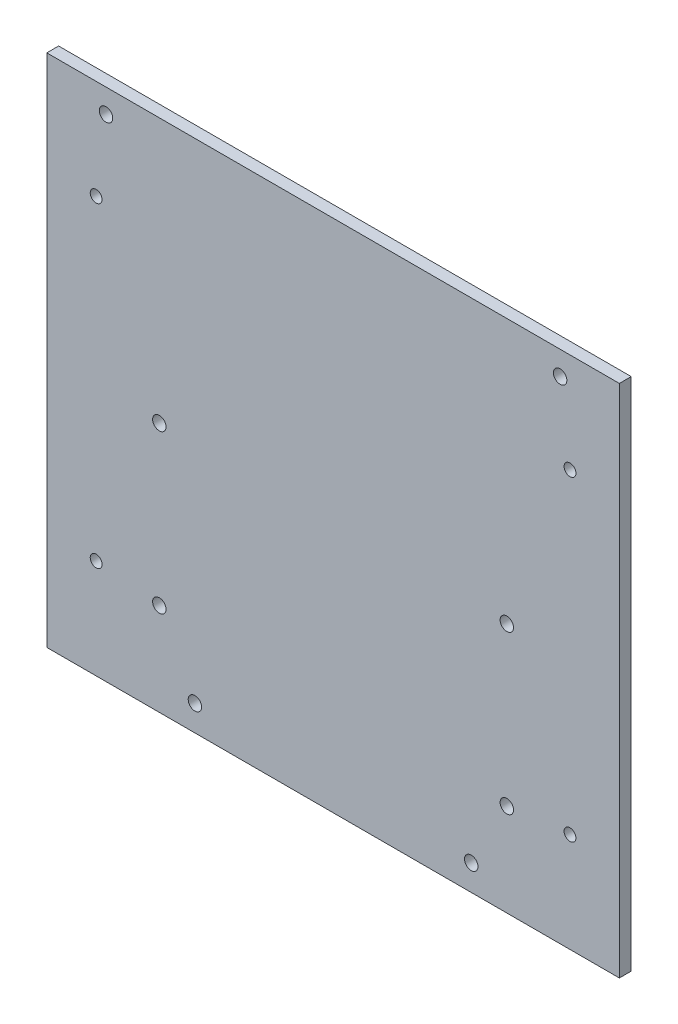
ISO-10303-21;
HEADER;
FILE_DESCRIPTION(('STEP AP214'),'2;1');
FILE_NAME('part.step','',(''),(''),'','','');
FILE_SCHEMA(('AUTOMOTIVE_DESIGN { 1 0 10303 214 1 1 1 1 }'));
ENDSEC;
DATA;
#1=APPLICATION_CONTEXT('core data for automotive mechanical design processes');
#2=APPLICATION_PROTOCOL_DEFINITION('international standard','automotive_design',2000,#1);
#3=PRODUCT_CONTEXT('',#1,'mechanical');
#4=PRODUCT('Part','Part','',(#3));
#5=PRODUCT_RELATED_PRODUCT_CATEGORY('part','',(#4));
#6=PRODUCT_DEFINITION_FORMATION('','',#4);
#7=PRODUCT_DEFINITION_CONTEXT('part definition',#1,'design');
#8=PRODUCT_DEFINITION('design','',#6,#7);
#9=PRODUCT_DEFINITION_SHAPE('','',#8);
#10=(LENGTH_UNIT() NAMED_UNIT(*) SI_UNIT(.MILLI.,.METRE.));
#11=(NAMED_UNIT(*) PLANE_ANGLE_UNIT() SI_UNIT($,.RADIAN.));
#12=(NAMED_UNIT(*) SI_UNIT($,.STERADIAN.) SOLID_ANGLE_UNIT());
#13=UNCERTAINTY_MEASURE_WITH_UNIT(LENGTH_MEASURE(1.E-05),#10,'distance_accuracy_value','');
#14=(GEOMETRIC_REPRESENTATION_CONTEXT(3) GLOBAL_UNCERTAINTY_ASSIGNED_CONTEXT((#13)) GLOBAL_UNIT_ASSIGNED_CONTEXT((#10,
#11,#12)) REPRESENTATION_CONTEXT('',''));
#15=CARTESIAN_POINT('',(0.,0.,0.));
#16=DIRECTION('',(0.,0.,1.));
#17=DIRECTION('',(1.,0.,0.));
#18=AXIS2_PLACEMENT_3D('',#15,#16,#17);
#19=CARTESIAN_POINT('',(0.,0.,3.));
#20=DIRECTION('',(0.,0.,-1.));
#21=DIRECTION('',(-1.,0.,0.));
#22=AXIS2_PLACEMENT_3D('',#19,#20,#21);
#23=PLANE('',#22);
#24=CARTESIAN_POINT('',(-57.4999999999998,124.4,3.));
#25=DIRECTION('',(0.,0.,1.));
#26=DIRECTION('',(1.,0.,0.));
#27=AXIS2_PLACEMENT_3D('',#24,#25,#26);
#28=CIRCLE('',#27,1.7);
#29=CARTESIAN_POINT('',(-55.7999999999998,124.4,3.));
#30=VERTEX_POINT('',#29);
#31=EDGE_CURVE('E117',#30,#30,#28,.T.);
#32=ORIENTED_EDGE('',*,*,#31,.F.);
#33=EDGE_LOOP('',(#32));
#34=FACE_BOUND('',#33,.T.);
#35=CARTESIAN_POINT('',(43.9999999999985,63.4388042254799,3.));
#36=DIRECTION('',(0.,0.,1.));
#37=DIRECTION('',(1.,0.,0.));
#38=AXIS2_PLACEMENT_3D('',#35,#36,#37);
#39=CIRCLE('',#38,1.7);
#40=CARTESIAN_POINT('',(45.6999999999985,63.4388042254799,3.));
#41=VERTEX_POINT('',#40);
#42=EDGE_CURVE('E399',#41,#41,#39,.T.);
#43=ORIENTED_EDGE('',*,*,#42,.F.);
#44=EDGE_LOOP('',(#43));
#45=FACE_BOUND('',#44,.T.);
#46=CARTESIAN_POINT('',(-34.9875,6.5,3.));
#47=DIRECTION('',(0.,0.,1.));
#48=DIRECTION('',(1.,0.,0.));
#49=AXIS2_PLACEMENT_3D('',#46,#47,#48);
#50=CIRCLE('',#49,1.7);
#51=CARTESIAN_POINT('',(-33.2875,6.5,3.));
#52=VERTEX_POINT('',#51);
#53=EDGE_CURVE('E398',#52,#52,#50,.T.);
#54=ORIENTED_EDGE('',*,*,#53,.F.);
#55=EDGE_LOOP('',(#54));
#56=FACE_BOUND('',#55,.T.);
#57=CARTESIAN_POINT('',(34.9875,6.5,3.));
#58=DIRECTION('',(0.,0.,1.));
#59=DIRECTION('',(1.,0.,0.));
#60=AXIS2_PLACEMENT_3D('',#57,#58,#59);
#61=CIRCLE('',#60,1.7);
#62=CARTESIAN_POINT('',(36.6875,6.5,3.));
#63=VERTEX_POINT('',#62);
#64=EDGE_CURVE('E395',#63,#63,#61,.T.);
#65=ORIENTED_EDGE('',*,*,#64,.F.);
#66=EDGE_LOOP('',(#65));
#67=FACE_BOUND('',#66,.T.);
#68=CARTESIAN_POINT('',(43.9999999999993,23.4388042254799,3.));
#69=DIRECTION('',(0.,0.,1.));
#70=DIRECTION('',(1.,0.,0.));
#71=AXIS2_PLACEMENT_3D('',#68,#69,#70);
#72=CIRCLE('',#71,1.69999999999999);
#73=CARTESIAN_POINT('',(45.6999999999993,23.4388042254799,3.));
#74=VERTEX_POINT('',#73);
#75=EDGE_CURVE('E402',#74,#74,#72,.T.);
#76=ORIENTED_EDGE('',*,*,#75,.F.);
#77=EDGE_LOOP('',(#76));
#78=FACE_BOUND('',#77,.T.);
#79=CARTESIAN_POINT('',(-44.0000000000007,23.4388042254779,3.));
#80=DIRECTION('',(0.,0.,1.));
#81=DIRECTION('',(1.,0.,0.));
#82=AXIS2_PLACEMENT_3D('',#79,#80,#81);
#83=CIRCLE('',#82,1.7);
#84=CARTESIAN_POINT('',(-42.3000000000007,23.4388042254779,3.));
#85=VERTEX_POINT('',#84);
#86=EDGE_CURVE('E407',#85,#85,#83,.T.);
#87=ORIENTED_EDGE('',*,*,#86,.F.);
#88=EDGE_LOOP('',(#87));
#89=FACE_BOUND('',#88,.T.);
#90=CARTESIAN_POINT('',(-44.000000000001,63.438804225477,3.));
#91=DIRECTION('',(0.,0.,1.));
#92=DIRECTION('',(1.,0.,0.));
#93=AXIS2_PLACEMENT_3D('',#90,#91,#92);
#94=CIRCLE('',#93,1.7);
#95=CARTESIAN_POINT('',(-42.300000000001,63.438804225477,3.));
#96=VERTEX_POINT('',#95);
#97=EDGE_CURVE('E392',#96,#96,#94,.T.);
#98=ORIENTED_EDGE('',*,*,#97,.F.);
#99=EDGE_LOOP('',(#98));
#100=FACE_BOUND('',#99,.T.);
#101=CARTESIAN_POINT('',(57.5,124.4,3.));
#102=DIRECTION('',(0.,0.,1.));
#103=DIRECTION('',(1.,0.,0.));
#104=AXIS2_PLACEMENT_3D('',#101,#102,#103);
#105=CIRCLE('',#104,1.7);
#106=CARTESIAN_POINT('',(59.2,124.4,3.));
#107=VERTEX_POINT('',#106);
#108=EDGE_CURVE('E389',#107,#107,#105,.T.);
#109=ORIENTED_EDGE('',*,*,#108,.F.);
#110=EDGE_LOOP('',(#109));
#111=FACE_BOUND('',#110,.T.);
#112=DIRECTION('',(0.,-1.,0.));
#113=VECTOR('',#112,1.);
#114=CARTESIAN_POINT('',(-72.5,0.,3.));
#115=LINE('',#114,#113);
#116=CARTESIAN_POINT('',(-72.5,130.4,3.));
#117=VERTEX_POINT('',#116);
#118=CARTESIAN_POINT('',(-72.5,0.,3.));
#119=VERTEX_POINT('',#118);
#120=EDGE_CURVE('E91',#117,#119,#115,.T.);
#121=ORIENTED_EDGE('',*,*,#120,.T.);
#122=DIRECTION('',(1.,0.,0.));
#123=VECTOR('',#122,1.);
#124=CARTESIAN_POINT('',(-72.5,0.,3.));
#125=LINE('',#124,#123);
#126=CARTESIAN_POINT('',(72.5,0.,3.));
#127=VERTEX_POINT('',#126);
#128=EDGE_CURVE('E86',#119,#127,#125,.T.);
#129=ORIENTED_EDGE('',*,*,#128,.T.);
#130=DIRECTION('',(0.,1.,0.));
#131=VECTOR('',#130,1.);
#132=CARTESIAN_POINT('',(72.5,0.,3.));
#133=LINE('',#132,#131);
#134=CARTESIAN_POINT('',(72.5,130.4,3.));
#135=VERTEX_POINT('',#134);
#136=EDGE_CURVE('E89',#127,#135,#133,.T.);
#137=ORIENTED_EDGE('',*,*,#136,.T.);
#138=DIRECTION('',(-1.,0.,0.));
#139=VECTOR('',#138,1.);
#140=CARTESIAN_POINT('',(-72.5,130.4,3.));
#141=LINE('',#140,#139);
#142=EDGE_CURVE('E56',#135,#117,#141,.T.);
#143=ORIENTED_EDGE('',*,*,#142,.T.);
#144=EDGE_LOOP('',(#121,#129,#137,#143));
#145=FACE_BOUND('',#144,.T.);
#146=CARTESIAN_POINT('',(-60.,105.2,3.));
#147=DIRECTION('',(0.,0.,1.));
#148=DIRECTION('',(1.,0.,0.));
#149=AXIS2_PLACEMENT_3D('',#146,#147,#148);
#150=CIRCLE('',#149,1.5);
#151=CARTESIAN_POINT('',(-58.5,105.2,3.));
#152=VERTEX_POINT('',#151);
#153=EDGE_CURVE('E107',#152,#152,#150,.T.);
#154=ORIENTED_EDGE('',*,*,#153,.F.);
#155=EDGE_LOOP('',(#154));
#156=FACE_BOUND('',#155,.T.);
#157=CARTESIAN_POINT('',(60.,105.2,3.));
#158=DIRECTION('',(0.,0.,1.));
#159=DIRECTION('',(1.,0.,0.));
#160=AXIS2_PLACEMENT_3D('',#157,#158,#159);
#161=CIRCLE('',#160,1.5);
#162=CARTESIAN_POINT('',(61.5,105.2,3.));
#163=VERTEX_POINT('',#162);
#164=EDGE_CURVE('E155',#163,#163,#161,.T.);
#165=ORIENTED_EDGE('',*,*,#164,.F.);
#166=EDGE_LOOP('',(#165));
#167=FACE_BOUND('',#166,.T.);
#168=CARTESIAN_POINT('',(60.,25.2,3.));
#169=DIRECTION('',(0.,0.,1.));
#170=DIRECTION('',(1.,0.,0.));
#171=AXIS2_PLACEMENT_3D('',#168,#169,#170);
#172=CIRCLE('',#171,1.5);
#173=CARTESIAN_POINT('',(61.5,25.2,3.));
#174=VERTEX_POINT('',#173);
#175=EDGE_CURVE('E149',#174,#174,#172,.T.);
#176=ORIENTED_EDGE('',*,*,#175,.F.);
#177=EDGE_LOOP('',(#176));
#178=FACE_BOUND('',#177,.T.);
#179=CARTESIAN_POINT('',(-60.,25.2,3.));
#180=DIRECTION('',(0.,0.,1.));
#181=DIRECTION('',(1.,0.,0.));
#182=AXIS2_PLACEMENT_3D('',#179,#180,#181);
#183=CIRCLE('',#182,1.5);
#184=CARTESIAN_POINT('',(-58.5,25.2,3.));
#185=VERTEX_POINT('',#184);
#186=EDGE_CURVE('E140',#185,#185,#183,.T.);
#187=ORIENTED_EDGE('',*,*,#186,.F.);
#188=EDGE_LOOP('',(#187));
#189=FACE_BOUND('',#188,.T.);
#190=ADVANCED_FACE('F37',(#34,#45,#56,#67,#78,#89,#100,#111,#145,#156,#167,#178,#189),#23,.F.);
#191=CARTESIAN_POINT('',(0.,0.,0.));
#192=DIRECTION('',(0.,0.,-1.));
#193=DIRECTION('',(-1.,0.,0.));
#194=AXIS2_PLACEMENT_3D('',#191,#192,#193);
#195=PLANE('',#194);
#196=CARTESIAN_POINT('',(-57.4999999999998,124.4,0.));
#197=DIRECTION('',(0.,0.,-1.));
#198=DIRECTION('',(-1.,0.,0.));
#199=AXIS2_PLACEMENT_3D('',#196,#197,#198);
#200=CIRCLE('',#199,1.7);
#201=CARTESIAN_POINT('',(-59.1999999999998,124.4,0.));
#202=VERTEX_POINT('',#201);
#203=EDGE_CURVE('E41',#202,#202,#200,.T.);
#204=ORIENTED_EDGE('',*,*,#203,.F.);
#205=EDGE_LOOP('',(#204));
#206=FACE_BOUND('',#205,.T.);
#207=CARTESIAN_POINT('',(43.9999999999985,63.4388042254799,0.));
#208=DIRECTION('',(0.,0.,-1.));
#209=DIRECTION('',(-1.,0.,0.));
#210=AXIS2_PLACEMENT_3D('',#207,#208,#209);
#211=CIRCLE('',#210,1.7);
#212=CARTESIAN_POINT('',(42.2999999999985,63.4388042254799,0.));
#213=VERTEX_POINT('',#212);
#214=EDGE_CURVE('E131',#213,#213,#211,.T.);
#215=ORIENTED_EDGE('',*,*,#214,.F.);
#216=EDGE_LOOP('',(#215));
#217=FACE_BOUND('',#216,.T.);
#218=CARTESIAN_POINT('',(-34.9875,6.5,0.));
#219=DIRECTION('',(0.,0.,-1.));
#220=DIRECTION('',(-1.,0.,0.));
#221=AXIS2_PLACEMENT_3D('',#218,#219,#220);
#222=CIRCLE('',#221,1.7);
#223=CARTESIAN_POINT('',(-36.6875,6.5,0.));
#224=VERTEX_POINT('',#223);
#225=EDGE_CURVE('E129',#224,#224,#222,.T.);
#226=ORIENTED_EDGE('',*,*,#225,.F.);
#227=EDGE_LOOP('',(#226));
#228=FACE_BOUND('',#227,.T.);
#229=CARTESIAN_POINT('',(34.9875,6.5,0.));
#230=DIRECTION('',(0.,0.,-1.));
#231=DIRECTION('',(-1.,0.,0.));
#232=AXIS2_PLACEMENT_3D('',#229,#230,#231);
#233=CIRCLE('',#232,1.7);
#234=CARTESIAN_POINT('',(33.2875,6.5,0.));
#235=VERTEX_POINT('',#234);
#236=EDGE_CURVE('E126',#235,#235,#233,.T.);
#237=ORIENTED_EDGE('',*,*,#236,.F.);
#238=EDGE_LOOP('',(#237));
#239=FACE_BOUND('',#238,.T.);
#240=CARTESIAN_POINT('',(43.9999999999993,23.4388042254799,0.));
#241=DIRECTION('',(0.,0.,-1.));
#242=DIRECTION('',(-1.,0.,0.));
#243=AXIS2_PLACEMENT_3D('',#240,#241,#242);
#244=CIRCLE('',#243,1.69999999999999);
#245=CARTESIAN_POINT('',(42.2999999999993,23.4388042254799,0.));
#246=VERTEX_POINT('',#245);
#247=EDGE_CURVE('E123',#246,#246,#244,.T.);
#248=ORIENTED_EDGE('',*,*,#247,.F.);
#249=EDGE_LOOP('',(#248));
#250=FACE_BOUND('',#249,.T.);
#251=CARTESIAN_POINT('',(-44.0000000000007,23.4388042254779,0.));
#252=DIRECTION('',(0.,0.,-1.));
#253=DIRECTION('',(-1.,0.,0.));
#254=AXIS2_PLACEMENT_3D('',#251,#252,#253);
#255=CIRCLE('',#254,1.7);
#256=CARTESIAN_POINT('',(-45.7000000000007,23.4388042254779,0.));
#257=VERTEX_POINT('',#256);
#258=EDGE_CURVE('E120',#257,#257,#255,.T.);
#259=ORIENTED_EDGE('',*,*,#258,.F.);
#260=EDGE_LOOP('',(#259));
#261=FACE_BOUND('',#260,.T.);
#262=CARTESIAN_POINT('',(-44.000000000001,63.438804225477,0.));
#263=DIRECTION('',(0.,0.,-1.));
#264=DIRECTION('',(-1.,0.,0.));
#265=AXIS2_PLACEMENT_3D('',#262,#263,#264);
#266=CIRCLE('',#265,1.7);
#267=CARTESIAN_POINT('',(-45.700000000001,63.438804225477,0.));
#268=VERTEX_POINT('',#267);
#269=EDGE_CURVE('E116',#268,#268,#266,.T.);
#270=ORIENTED_EDGE('',*,*,#269,.F.);
#271=EDGE_LOOP('',(#270));
#272=FACE_BOUND('',#271,.T.);
#273=CARTESIAN_POINT('',(57.5,124.4,0.));
#274=DIRECTION('',(0.,0.,-1.));
#275=DIRECTION('',(-1.,0.,0.));
#276=AXIS2_PLACEMENT_3D('',#273,#274,#275);
#277=CIRCLE('',#276,1.7);
#278=CARTESIAN_POINT('',(55.8,124.4,0.));
#279=VERTEX_POINT('',#278);
#280=EDGE_CURVE('E113',#279,#279,#277,.T.);
#281=ORIENTED_EDGE('',*,*,#280,.F.);
#282=EDGE_LOOP('',(#281));
#283=FACE_BOUND('',#282,.T.);
#284=CARTESIAN_POINT('',(60.,25.2,0.));
#285=DIRECTION('',(0.,0.,1.));
#286=DIRECTION('',(1.,0.,0.));
#287=AXIS2_PLACEMENT_3D('',#284,#285,#286);
#288=CIRCLE('',#287,1.5);
#289=CARTESIAN_POINT('',(61.5,25.2,0.));
#290=VERTEX_POINT('',#289);
#291=EDGE_CURVE('E145',#290,#290,#288,.T.);
#292=ORIENTED_EDGE('',*,*,#291,.T.);
#293=EDGE_LOOP('',(#292));
#294=FACE_BOUND('',#293,.T.);
#295=CARTESIAN_POINT('',(-60.,105.2,0.));
#296=DIRECTION('',(0.,0.,1.));
#297=DIRECTION('',(1.,0.,0.));
#298=AXIS2_PLACEMENT_3D('',#295,#296,#297);
#299=CIRCLE('',#298,1.5);
#300=CARTESIAN_POINT('',(-58.5,105.2,0.));
#301=VERTEX_POINT('',#300);
#302=EDGE_CURVE('E158',#301,#301,#299,.T.);
#303=ORIENTED_EDGE('',*,*,#302,.T.);
#304=EDGE_LOOP('',(#303));
#305=FACE_BOUND('',#304,.T.);
#306=DIRECTION('',(0.,-1.,0.));
#307=VECTOR('',#306,1.);
#308=CARTESIAN_POINT('',(-72.5,0.,0.));
#309=LINE('',#308,#307);
#310=CARTESIAN_POINT('',(-72.5,130.4,0.));
#311=VERTEX_POINT('',#310);
#312=CARTESIAN_POINT('',(-72.5,0.,0.));
#313=VERTEX_POINT('',#312);
#314=EDGE_CURVE('E104',#311,#313,#309,.T.);
#315=ORIENTED_EDGE('',*,*,#314,.F.);
#316=DIRECTION('',(-1.,0.,0.));
#317=VECTOR('',#316,1.);
#318=CARTESIAN_POINT('',(-72.5,130.4,0.));
#319=LINE('',#318,#317);
#320=CARTESIAN_POINT('',(72.5,130.4,0.));
#321=VERTEX_POINT('',#320);
#322=EDGE_CURVE('E79',#321,#311,#319,.T.);
#323=ORIENTED_EDGE('',*,*,#322,.F.);
#324=DIRECTION('',(0.,1.,0.));
#325=VECTOR('',#324,1.);
#326=CARTESIAN_POINT('',(72.5,0.,0.));
#327=LINE('',#326,#325);
#328=CARTESIAN_POINT('',(72.5,0.,0.));
#329=VERTEX_POINT('',#328);
#330=EDGE_CURVE('E73',#329,#321,#327,.T.);
#331=ORIENTED_EDGE('',*,*,#330,.F.);
#332=DIRECTION('',(1.,0.,0.));
#333=VECTOR('',#332,1.);
#334=CARTESIAN_POINT('',(-72.5,0.,0.));
#335=LINE('',#334,#333);
#336=EDGE_CURVE('E95',#313,#329,#335,.T.);
#337=ORIENTED_EDGE('',*,*,#336,.F.);
#338=EDGE_LOOP('',(#315,#323,#331,#337));
#339=FACE_BOUND('',#338,.T.);
#340=CARTESIAN_POINT('',(60.,105.2,0.));
#341=DIRECTION('',(0.,0.,1.));
#342=DIRECTION('',(1.,0.,0.));
#343=AXIS2_PLACEMENT_3D('',#340,#341,#342);
#344=CIRCLE('',#343,1.5);
#345=CARTESIAN_POINT('',(61.5,105.2,0.));
#346=VERTEX_POINT('',#345);
#347=EDGE_CURVE('E152',#346,#346,#344,.T.);
#348=ORIENTED_EDGE('',*,*,#347,.T.);
#349=EDGE_LOOP('',(#348));
#350=FACE_BOUND('',#349,.T.);
#351=CARTESIAN_POINT('',(-60.,25.2,0.));
#352=DIRECTION('',(0.,0.,1.));
#353=DIRECTION('',(1.,0.,0.));
#354=AXIS2_PLACEMENT_3D('',#351,#352,#353);
#355=CIRCLE('',#354,1.5);
#356=CARTESIAN_POINT('',(-58.5,25.2,0.));
#357=VERTEX_POINT('',#356);
#358=EDGE_CURVE('E136',#357,#357,#355,.T.);
#359=ORIENTED_EDGE('',*,*,#358,.T.);
#360=EDGE_LOOP('',(#359));
#361=FACE_BOUND('',#360,.T.);
#362=ADVANCED_FACE('F166',(#206,#217,#228,#239,#250,#261,#272,#283,#294,#305,#339,#350,#361),
#195,.T.);
#363=CARTESIAN_POINT('',(-72.5,0.,3.));
#364=DIRECTION('',(1.,0.,0.));
#365=DIRECTION('',(0.,0.,-1.));
#366=AXIS2_PLACEMENT_3D('',#363,#364,#365);
#367=PLANE('',#366);
#368=ORIENTED_EDGE('',*,*,#314,.T.);
#369=DIRECTION('',(0.,0.,-1.));
#370=VECTOR('',#369,1.);
#371=CARTESIAN_POINT('',(-72.5,0.,3.));
#372=LINE('',#371,#370);
#373=EDGE_CURVE('E11',#119,#313,#372,.T.);
#374=ORIENTED_EDGE('',*,*,#373,.F.);
#375=ORIENTED_EDGE('',*,*,#120,.F.);
#376=DIRECTION('',(0.,0.,-1.));
#377=VECTOR('',#376,1.);
#378=CARTESIAN_POINT('',(-72.5,130.4,3.));
#379=LINE('',#378,#377);
#380=EDGE_CURVE('E100',#117,#311,#379,.T.);
#381=ORIENTED_EDGE('',*,*,#380,.T.);
#382=EDGE_LOOP('',(#368,#374,#375,#381));
#383=FACE_BOUND('',#382,.T.);
#384=ADVANCED_FACE('F39',(#383),#367,.F.);
#385=CARTESIAN_POINT('',(-72.5,0.,3.));
#386=DIRECTION('',(0.,1.,0.));
#387=DIRECTION('',(0.,0.,1.));
#388=AXIS2_PLACEMENT_3D('',#385,#386,#387);
#389=PLANE('',#388);
#390=ORIENTED_EDGE('',*,*,#336,.T.);
#391=DIRECTION('',(0.,0.,-1.));
#392=VECTOR('',#391,1.);
#393=CARTESIAN_POINT('',(72.5,0.,3.));
#394=LINE('',#393,#392);
#395=EDGE_CURVE('E47',#127,#329,#394,.T.);
#396=ORIENTED_EDGE('',*,*,#395,.F.);
#397=ORIENTED_EDGE('',*,*,#128,.F.);
#398=ORIENTED_EDGE('',*,*,#373,.T.);
#399=EDGE_LOOP('',(#390,#396,#397,#398));
#400=FACE_BOUND('',#399,.T.);
#401=ADVANCED_FACE('F94',(#400),#389,.F.);
#402=CARTESIAN_POINT('',(72.5,0.,3.));
#403=DIRECTION('',(-1.,0.,0.));
#404=DIRECTION('',(0.,0.,1.));
#405=AXIS2_PLACEMENT_3D('',#402,#403,#404);
#406=PLANE('',#405);
#407=ORIENTED_EDGE('',*,*,#330,.T.);
#408=DIRECTION('',(0.,0.,-1.));
#409=VECTOR('',#408,1.);
#410=CARTESIAN_POINT('',(72.5,130.4,3.));
#411=LINE('',#410,#409);
#412=EDGE_CURVE('E96',#135,#321,#411,.T.);
#413=ORIENTED_EDGE('',*,*,#412,.F.);
#414=ORIENTED_EDGE('',*,*,#136,.F.);
#415=ORIENTED_EDGE('',*,*,#395,.T.);
#416=EDGE_LOOP('',(#407,#413,#414,#415));
#417=FACE_BOUND('',#416,.T.);
#418=ADVANCED_FACE('F98',(#417),#406,.F.);
#419=CARTESIAN_POINT('',(-72.5,130.4,3.));
#420=DIRECTION('',(0.,-1.,0.));
#421=DIRECTION('',(0.,0.,-1.));
#422=AXIS2_PLACEMENT_3D('',#419,#420,#421);
#423=PLANE('',#422);
#424=ORIENTED_EDGE('',*,*,#322,.T.);
#425=ORIENTED_EDGE('',*,*,#380,.F.);
#426=ORIENTED_EDGE('',*,*,#142,.F.);
#427=ORIENTED_EDGE('',*,*,#412,.T.);
#428=EDGE_LOOP('',(#424,#425,#426,#427));
#429=FACE_BOUND('',#428,.T.);
#430=ADVANCED_FACE('F172',(#429),#423,.F.);
#431=CARTESIAN_POINT('',(-60.,105.2,3.));
#432=DIRECTION('',(0.,0.,-1.));
#433=DIRECTION('',(-1.,0.,0.));
#434=AXIS2_PLACEMENT_3D('',#431,#432,#433);
#435=CYLINDRICAL_SURFACE('',#434,1.5);
#436=ORIENTED_EDGE('',*,*,#153,.T.);
#437=EDGE_LOOP('',(#436));
#438=FACE_BOUND('',#437,.T.);
#439=ORIENTED_EDGE('',*,*,#302,.F.);
#440=EDGE_LOOP('',(#439));
#441=FACE_BOUND('',#440,.T.);
#442=ADVANCED_FACE('F169',(#438,#441),#435,.F.);
#443=CARTESIAN_POINT('',(60.,105.2,3.));
#444=DIRECTION('',(0.,0.,-1.));
#445=DIRECTION('',(-1.,0.,0.));
#446=AXIS2_PLACEMENT_3D('',#443,#444,#445);
#447=CYLINDRICAL_SURFACE('',#446,1.5);
#448=ORIENTED_EDGE('',*,*,#164,.T.);
#449=EDGE_LOOP('',(#448));
#450=FACE_BOUND('',#449,.T.);
#451=ORIENTED_EDGE('',*,*,#347,.F.);
#452=EDGE_LOOP('',(#451));
#453=FACE_BOUND('',#452,.T.);
#454=ADVANCED_FACE('F171',(#450,#453),#447,.F.);
#455=CARTESIAN_POINT('',(60.,25.2,3.));
#456=DIRECTION('',(0.,0.,-1.));
#457=DIRECTION('',(-1.,0.,0.));
#458=AXIS2_PLACEMENT_3D('',#455,#456,#457);
#459=CYLINDRICAL_SURFACE('',#458,1.5);
#460=ORIENTED_EDGE('',*,*,#175,.T.);
#461=EDGE_LOOP('',(#460));
#462=FACE_BOUND('',#461,.T.);
#463=ORIENTED_EDGE('',*,*,#291,.F.);
#464=EDGE_LOOP('',(#463));
#465=FACE_BOUND('',#464,.T.);
#466=ADVANCED_FACE('F179',(#462,#465),#459,.F.);
#467=CARTESIAN_POINT('',(-60.,25.2,3.));
#468=DIRECTION('',(0.,0.,-1.));
#469=DIRECTION('',(-1.,0.,0.));
#470=AXIS2_PLACEMENT_3D('',#467,#468,#469);
#471=CYLINDRICAL_SURFACE('',#470,1.5);
#472=ORIENTED_EDGE('',*,*,#186,.T.);
#473=EDGE_LOOP('',(#472));
#474=FACE_BOUND('',#473,.T.);
#475=ORIENTED_EDGE('',*,*,#358,.F.);
#476=EDGE_LOOP('',(#475));
#477=FACE_BOUND('',#476,.T.);
#478=ADVANCED_FACE('F225',(#474,#477),#471,.F.);
#479=CARTESIAN_POINT('',(57.5,124.4,-7.));
#480=DIRECTION('',(0.,0.,1.));
#481=DIRECTION('',(1.,0.,0.));
#482=AXIS2_PLACEMENT_3D('',#479,#480,#481);
#483=CYLINDRICAL_SURFACE('',#482,1.7);
#484=ORIENTED_EDGE('',*,*,#280,.T.);
#485=EDGE_LOOP('',(#484));
#486=FACE_BOUND('',#485,.T.);
#487=ORIENTED_EDGE('',*,*,#108,.T.);
#488=EDGE_LOOP('',(#487));
#489=FACE_BOUND('',#488,.T.);
#490=ADVANCED_FACE('F219',(#486,#489),#483,.F.);
#491=CARTESIAN_POINT('',(-44.000000000001,63.438804225477,-7.));
#492=DIRECTION('',(0.,0.,1.));
#493=DIRECTION('',(1.,0.,0.));
#494=AXIS2_PLACEMENT_3D('',#491,#492,#493);
#495=CYLINDRICAL_SURFACE('',#494,1.7);
#496=ORIENTED_EDGE('',*,*,#269,.T.);
#497=EDGE_LOOP('',(#496));
#498=FACE_BOUND('',#497,.T.);
#499=ORIENTED_EDGE('',*,*,#97,.T.);
#500=EDGE_LOOP('',(#499));
#501=FACE_BOUND('',#500,.T.);
#502=ADVANCED_FACE('F224',(#498,#501),#495,.F.);
#503=CARTESIAN_POINT('',(-44.0000000000007,23.4388042254779,-7.));
#504=DIRECTION('',(0.,0.,1.));
#505=DIRECTION('',(1.,0.,0.));
#506=AXIS2_PLACEMENT_3D('',#503,#504,#505);
#507=CYLINDRICAL_SURFACE('',#506,1.7);
#508=ORIENTED_EDGE('',*,*,#258,.T.);
#509=EDGE_LOOP('',(#508));
#510=FACE_BOUND('',#509,.T.);
#511=ORIENTED_EDGE('',*,*,#86,.T.);
#512=EDGE_LOOP('',(#511));
#513=FACE_BOUND('',#512,.T.);
#514=ADVANCED_FACE('F238',(#510,#513),#507,.F.);
#515=CARTESIAN_POINT('',(43.9999999999993,23.4388042254799,-7.));
#516=DIRECTION('',(0.,0.,1.));
#517=DIRECTION('',(1.,0.,0.));
#518=AXIS2_PLACEMENT_3D('',#515,#516,#517);
#519=CYLINDRICAL_SURFACE('',#518,1.69999999999999);
#520=ORIENTED_EDGE('',*,*,#247,.T.);
#521=EDGE_LOOP('',(#520));
#522=FACE_BOUND('',#521,.T.);
#523=ORIENTED_EDGE('',*,*,#75,.T.);
#524=EDGE_LOOP('',(#523));
#525=FACE_BOUND('',#524,.T.);
#526=ADVANCED_FACE('F249',(#522,#525),#519,.F.);
#527=CARTESIAN_POINT('',(34.9875,6.5,-7.));
#528=DIRECTION('',(0.,0.,1.));
#529=DIRECTION('',(1.,0.,0.));
#530=AXIS2_PLACEMENT_3D('',#527,#528,#529);
#531=CYLINDRICAL_SURFACE('',#530,1.7);
#532=ORIENTED_EDGE('',*,*,#236,.T.);
#533=EDGE_LOOP('',(#532));
#534=FACE_BOUND('',#533,.T.);
#535=ORIENTED_EDGE('',*,*,#64,.T.);
#536=EDGE_LOOP('',(#535));
#537=FACE_BOUND('',#536,.T.);
#538=ADVANCED_FACE('F260',(#534,#537),#531,.F.);
#539=CARTESIAN_POINT('',(-34.9875,6.5,-7.));
#540=DIRECTION('',(0.,0.,1.));
#541=DIRECTION('',(1.,0.,0.));
#542=AXIS2_PLACEMENT_3D('',#539,#540,#541);
#543=CYLINDRICAL_SURFACE('',#542,1.7);
#544=ORIENTED_EDGE('',*,*,#225,.T.);
#545=EDGE_LOOP('',(#544));
#546=FACE_BOUND('',#545,.T.);
#547=ORIENTED_EDGE('',*,*,#53,.T.);
#548=EDGE_LOOP('',(#547));
#549=FACE_BOUND('',#548,.T.);
#550=ADVANCED_FACE('F271',(#546,#549),#543,.F.);
#551=CARTESIAN_POINT('',(43.9999999999985,63.4388042254799,-7.));
#552=DIRECTION('',(0.,0.,1.));
#553=DIRECTION('',(1.,0.,0.));
#554=AXIS2_PLACEMENT_3D('',#551,#552,#553);
#555=CYLINDRICAL_SURFACE('',#554,1.7);
#556=ORIENTED_EDGE('',*,*,#214,.T.);
#557=EDGE_LOOP('',(#556));
#558=FACE_BOUND('',#557,.T.);
#559=ORIENTED_EDGE('',*,*,#42,.T.);
#560=EDGE_LOOP('',(#559));
#561=FACE_BOUND('',#560,.T.);
#562=ADVANCED_FACE('F282',(#558,#561),#555,.F.);
#563=CARTESIAN_POINT('',(-57.4999999999998,124.4,-7.));
#564=DIRECTION('',(0.,0.,1.));
#565=DIRECTION('',(1.,0.,0.));
#566=AXIS2_PLACEMENT_3D('',#563,#564,#565);
#567=CYLINDRICAL_SURFACE('',#566,1.7);
#568=ORIENTED_EDGE('',*,*,#203,.T.);
#569=EDGE_LOOP('',(#568));
#570=FACE_BOUND('',#569,.T.);
#571=ORIENTED_EDGE('',*,*,#31,.T.);
#572=EDGE_LOOP('',(#571));
#573=FACE_BOUND('',#572,.T.);
#574=ADVANCED_FACE('F293',(#570,#573),#567,.F.);
#575=CLOSED_SHELL('',(#190,#362,#384,#401,#418,#430,#442,#454,#466,#478,#490,#502,#514,#526,
#538,#550,#562,#574));
#576=MANIFOLD_SOLID_BREP('B2',#575);
#577=ADVANCED_BREP_SHAPE_REPRESENTATION('',(#18,#576),#14);
#578=SHAPE_DEFINITION_REPRESENTATION(#9,#577);
ENDSEC;
END-ISO-10303-21;
